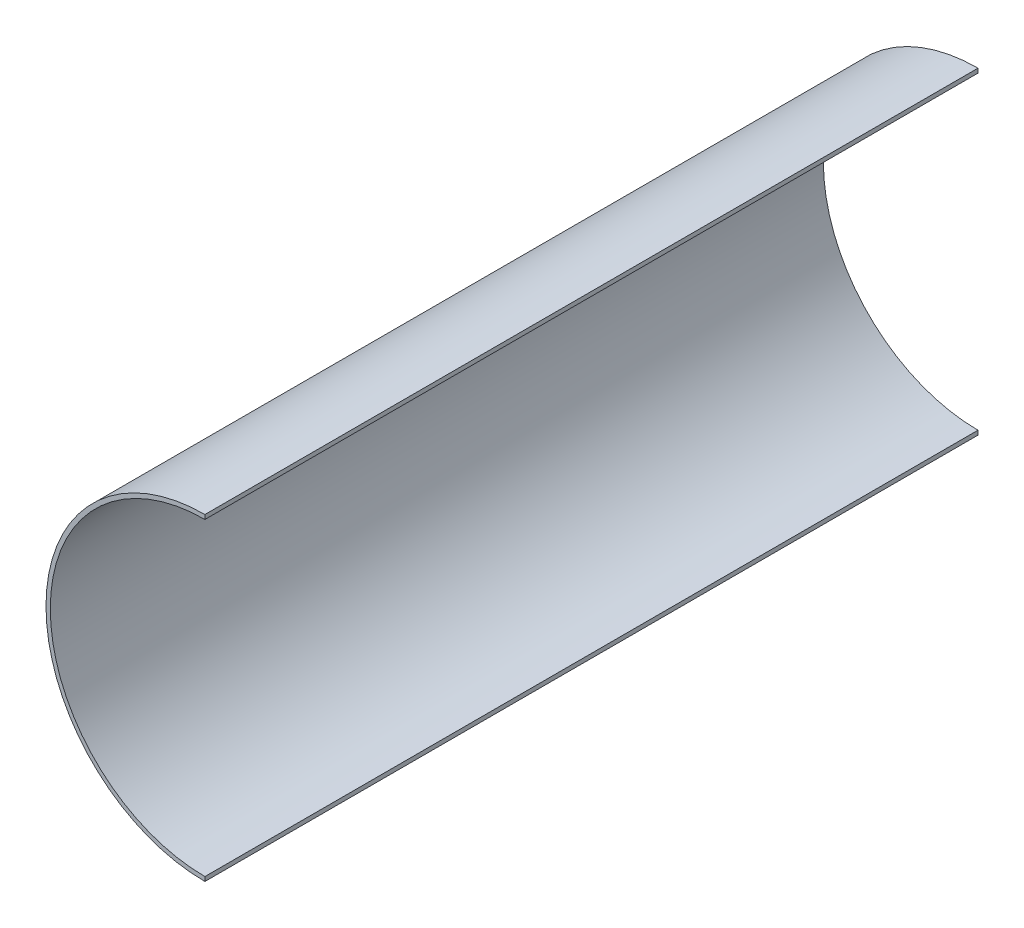
ISO-10303-21;
HEADER;
FILE_DESCRIPTION(('STEP AP214'),'2;1');
FILE_NAME('part.step','',(''),(''),'','','');
FILE_SCHEMA(('AUTOMOTIVE_DESIGN { 1 0 10303 214 1 1 1 1 }'));
ENDSEC;
DATA;
#1=APPLICATION_CONTEXT('core data for automotive mechanical design processes');
#2=APPLICATION_PROTOCOL_DEFINITION('international standard','automotive_design',2000,#1);
#3=PRODUCT_CONTEXT('',#1,'mechanical');
#4=PRODUCT('Part','Part','',(#3));
#5=PRODUCT_RELATED_PRODUCT_CATEGORY('part','',(#4));
#6=PRODUCT_DEFINITION_FORMATION('','',#4);
#7=PRODUCT_DEFINITION_CONTEXT('part definition',#1,'design');
#8=PRODUCT_DEFINITION('design','',#6,#7);
#9=PRODUCT_DEFINITION_SHAPE('','',#8);
#10=(LENGTH_UNIT() NAMED_UNIT(*) SI_UNIT(.MILLI.,.METRE.));
#11=(NAMED_UNIT(*) PLANE_ANGLE_UNIT() SI_UNIT($,.RADIAN.));
#12=(NAMED_UNIT(*) SI_UNIT($,.STERADIAN.) SOLID_ANGLE_UNIT());
#13=UNCERTAINTY_MEASURE_WITH_UNIT(LENGTH_MEASURE(1.E-05),#10,'distance_accuracy_value','');
#14=(GEOMETRIC_REPRESENTATION_CONTEXT(3) GLOBAL_UNCERTAINTY_ASSIGNED_CONTEXT((#13)) GLOBAL_UNIT_ASSIGNED_CONTEXT((#10,
#11,#12)) REPRESENTATION_CONTEXT('',''));
#15=CARTESIAN_POINT('',(0.,0.,0.));
#16=DIRECTION('',(0.,0.,1.));
#17=DIRECTION('',(1.,0.,0.));
#18=AXIS2_PLACEMENT_3D('',#15,#16,#17);
#19=CARTESIAN_POINT('',(0.,0.,90.));
#20=DIRECTION('',(0.,0.,1.));
#21=DIRECTION('',(1.,0.,0.));
#22=AXIS2_PLACEMENT_3D('',#19,#20,#21);
#23=PLANE('',#22);
#24=DIRECTION('',(0.,1.,0.));
#25=VECTOR('',#24,1.);
#26=CARTESIAN_POINT('',(0.,20.4292103592398,90.));
#27=LINE('',#26,#25);
#28=CARTESIAN_POINT('',(0.,18.,90.));
#29=VERTEX_POINT('',#28);
#30=CARTESIAN_POINT('',(0.,18.5,90.));
#31=VERTEX_POINT('',#30);
#32=EDGE_CURVE('E66',#29,#31,#27,.T.);
#33=ORIENTED_EDGE('',*,*,#32,.T.);
#34=CARTESIAN_POINT('',(0.,0.,90.));
#35=DIRECTION('',(0.,0.,1.));
#36=DIRECTION('',(1.,0.,0.));
#37=AXIS2_PLACEMENT_3D('',#34,#35,#36);
#38=CIRCLE('',#37,18.5);
#39=CARTESIAN_POINT('',(0.,-18.5,90.));
#40=VERTEX_POINT('',#39);
#41=EDGE_CURVE('E106',#31,#40,#38,.T.);
#42=ORIENTED_EDGE('',*,*,#41,.T.);
#43=CARTESIAN_POINT('',(0.,-18.,90.));
#44=VERTEX_POINT('',#43);
#45=EDGE_CURVE('E85',#40,#44,#27,.T.);
#46=ORIENTED_EDGE('',*,*,#45,.T.);
#47=CARTESIAN_POINT('',(0.,0.,90.));
#48=DIRECTION('',(0.,0.,1.));
#49=DIRECTION('',(1.,0.,0.));
#50=AXIS2_PLACEMENT_3D('',#47,#48,#49);
#51=CIRCLE('',#50,18.);
#52=EDGE_CURVE('E107',#29,#44,#51,.T.);
#53=ORIENTED_EDGE('',*,*,#52,.F.);
#54=EDGE_LOOP('',(#33,#42,#46,#53));
#55=FACE_BOUND('',#54,.T.);
#56=ADVANCED_FACE('F43',(#55),#23,.T.);
#57=CARTESIAN_POINT('',(0.,0.,0.));
#58=DIRECTION('',(0.,0.,1.));
#59=DIRECTION('',(1.,0.,0.));
#60=AXIS2_PLACEMENT_3D('',#57,#58,#59);
#61=PLANE('',#60);
#62=CARTESIAN_POINT('',(0.,0.,0.));
#63=DIRECTION('',(0.,0.,1.));
#64=DIRECTION('',(1.,0.,0.));
#65=AXIS2_PLACEMENT_3D('',#62,#63,#64);
#66=CIRCLE('',#65,18.5);
#67=CARTESIAN_POINT('',(0.,18.5,0.));
#68=VERTEX_POINT('',#67);
#69=CARTESIAN_POINT('',(0.,-18.5,0.));
#70=VERTEX_POINT('',#69);
#71=EDGE_CURVE('E98',#68,#70,#66,.T.);
#72=ORIENTED_EDGE('',*,*,#71,.F.);
#73=DIRECTION('',(0.,1.,0.));
#74=VECTOR('',#73,1.);
#75=CARTESIAN_POINT('',(0.,20.4292103592398,0.));
#76=LINE('',#75,#74);
#77=CARTESIAN_POINT('',(0.,18.,0.));
#78=VERTEX_POINT('',#77);
#79=EDGE_CURVE('E102',#78,#68,#76,.T.);
#80=ORIENTED_EDGE('',*,*,#79,.F.);
#81=CARTESIAN_POINT('',(0.,0.,0.));
#82=DIRECTION('',(0.,0.,1.));
#83=DIRECTION('',(1.,0.,0.));
#84=AXIS2_PLACEMENT_3D('',#81,#82,#83);
#85=CIRCLE('',#84,18.);
#86=CARTESIAN_POINT('',(0.,-18.,0.));
#87=VERTEX_POINT('',#86);
#88=EDGE_CURVE('E100',#78,#87,#85,.T.);
#89=ORIENTED_EDGE('',*,*,#88,.T.);
#90=EDGE_CURVE('E59',#70,#87,#76,.T.);
#91=ORIENTED_EDGE('',*,*,#90,.F.);
#92=EDGE_LOOP('',(#72,#80,#89,#91));
#93=FACE_BOUND('',#92,.T.);
#94=ADVANCED_FACE('F96',(#93),#61,.F.);
#95=CARTESIAN_POINT('',(0.,0.,90.));
#96=DIRECTION('',(0.,0.,-1.));
#97=DIRECTION('',(-1.,0.,0.));
#98=AXIS2_PLACEMENT_3D('',#95,#96,#97);
#99=CYLINDRICAL_SURFACE('',#98,18.5);
#100=ORIENTED_EDGE('',*,*,#41,.F.);
#101=DIRECTION('',(0.,0.,-1.));
#102=VECTOR('',#101,1.);
#103=CARTESIAN_POINT('',(0.,18.5,90.));
#104=LINE('',#103,#102);
#105=EDGE_CURVE('E91',#31,#68,#104,.T.);
#106=ORIENTED_EDGE('',*,*,#105,.T.);
#107=ORIENTED_EDGE('',*,*,#71,.T.);
#108=DIRECTION('',(0.,0.,-1.));
#109=VECTOR('',#108,1.);
#110=CARTESIAN_POINT('',(0.,-18.5,90.));
#111=LINE('',#110,#109);
#112=EDGE_CURVE('E82',#70,#40,#111,.F.);
#113=ORIENTED_EDGE('',*,*,#112,.T.);
#114=EDGE_LOOP('',(#100,#106,#107,#113));
#115=FACE_BOUND('',#114,.T.);
#116=ADVANCED_FACE('F45',(#115),#99,.T.);
#117=CARTESIAN_POINT('',(0.,0.,90.));
#118=DIRECTION('',(0.,0.,-1.));
#119=DIRECTION('',(-1.,0.,0.));
#120=AXIS2_PLACEMENT_3D('',#117,#118,#119);
#121=CYLINDRICAL_SURFACE('',#120,18.);
#122=DIRECTION('',(0.,0.,-1.));
#123=VECTOR('',#122,1.);
#124=CARTESIAN_POINT('',(0.,18.,90.));
#125=LINE('',#124,#123);
#126=EDGE_CURVE('E11',#29,#78,#125,.T.);
#127=ORIENTED_EDGE('',*,*,#126,.F.);
#128=ORIENTED_EDGE('',*,*,#52,.T.);
#129=DIRECTION('',(0.,0.,-1.));
#130=VECTOR('',#129,1.);
#131=CARTESIAN_POINT('',(0.,-18.,90.));
#132=LINE('',#131,#130);
#133=EDGE_CURVE('E52',#87,#44,#132,.F.);
#134=ORIENTED_EDGE('',*,*,#133,.F.);
#135=ORIENTED_EDGE('',*,*,#88,.F.);
#136=EDGE_LOOP('',(#127,#128,#134,#135));
#137=FACE_BOUND('',#136,.T.);
#138=ADVANCED_FACE('F121',(#137),#121,.F.);
#139=CARTESIAN_POINT('',(0.,20.4292103592398,90.));
#140=DIRECTION('',(-1.,0.,0.));
#141=DIRECTION('',(0.,0.,1.));
#142=AXIS2_PLACEMENT_3D('',#139,#140,#141);
#143=PLANE('',#142);
#144=ORIENTED_EDGE('',*,*,#90,.T.);
#145=ORIENTED_EDGE('',*,*,#133,.T.);
#146=ORIENTED_EDGE('',*,*,#45,.F.);
#147=ORIENTED_EDGE('',*,*,#112,.F.);
#148=EDGE_LOOP('',(#144,#145,#146,#147));
#149=FACE_BOUND('',#148,.T.);
#150=ADVANCED_FACE('F83',(#149),#143,.F.);
#151=ORIENTED_EDGE('',*,*,#32,.F.);
#152=ORIENTED_EDGE('',*,*,#126,.T.);
#153=ORIENTED_EDGE('',*,*,#79,.T.);
#154=ORIENTED_EDGE('',*,*,#105,.F.);
#155=EDGE_LOOP('',(#151,#152,#153,#154));
#156=FACE_BOUND('',#155,.T.);
#157=ADVANCED_FACE('F122',(#156),#143,.F.);
#158=CLOSED_SHELL('',(#56,#94,#116,#138,#150,#157));
#159=MANIFOLD_SOLID_BREP('B2',#158);
#160=ADVANCED_BREP_SHAPE_REPRESENTATION('',(#18,#159),#14);
#161=SHAPE_DEFINITION_REPRESENTATION(#9,#160);
ENDSEC;
END-ISO-10303-21;
